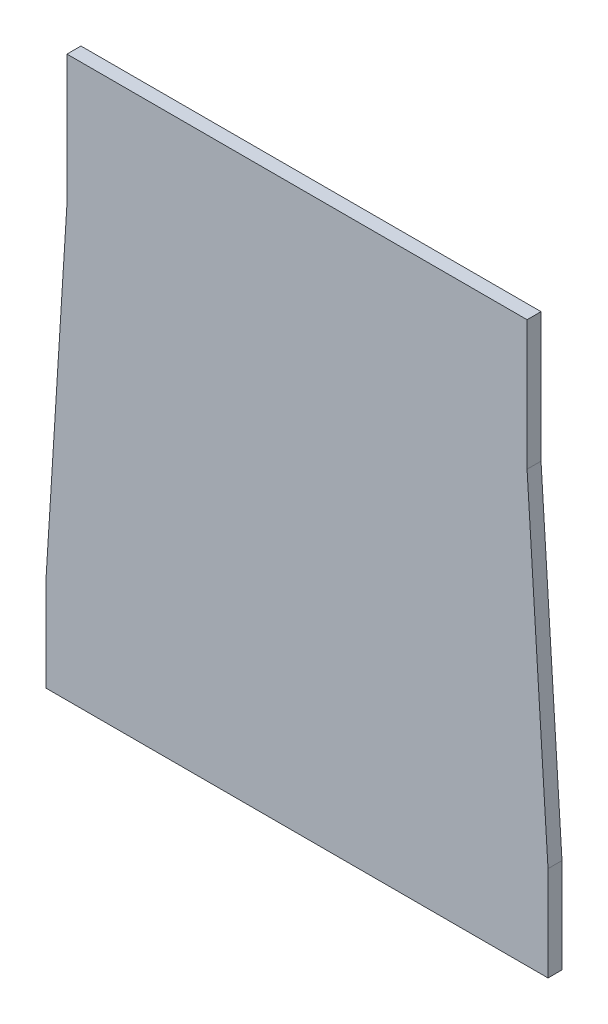
ISO-10303-21;
HEADER;
FILE_DESCRIPTION(('STEP AP214'),'2;1');
FILE_NAME('part.step','',(''),(''),'','','');
FILE_SCHEMA(('AUTOMOTIVE_DESIGN { 1 0 10303 214 1 1 1 1 }'));
ENDSEC;
DATA;
#1=APPLICATION_CONTEXT('core data for automotive mechanical design processes');
#2=APPLICATION_PROTOCOL_DEFINITION('international standard','automotive_design',2000,#1);
#3=PRODUCT_CONTEXT('',#1,'mechanical');
#4=PRODUCT('Part','Part','',(#3));
#5=PRODUCT_RELATED_PRODUCT_CATEGORY('part','',(#4));
#6=PRODUCT_DEFINITION_FORMATION('','',#4);
#7=PRODUCT_DEFINITION_CONTEXT('part definition',#1,'design');
#8=PRODUCT_DEFINITION('design','',#6,#7);
#9=PRODUCT_DEFINITION_SHAPE('','',#8);
#10=(LENGTH_UNIT() NAMED_UNIT(*) SI_UNIT(.MILLI.,.METRE.));
#11=(NAMED_UNIT(*) PLANE_ANGLE_UNIT() SI_UNIT($,.RADIAN.));
#12=(NAMED_UNIT(*) SI_UNIT($,.STERADIAN.) SOLID_ANGLE_UNIT());
#13=UNCERTAINTY_MEASURE_WITH_UNIT(LENGTH_MEASURE(1.E-05),#10,'distance_accuracy_value','');
#14=(GEOMETRIC_REPRESENTATION_CONTEXT(3) GLOBAL_UNCERTAINTY_ASSIGNED_CONTEXT((#13)) GLOBAL_UNIT_ASSIGNED_CONTEXT((#10,
#11,#12)) REPRESENTATION_CONTEXT('',''));
#15=CARTESIAN_POINT('',(0.,0.,0.));
#16=DIRECTION('',(0.,0.,1.));
#17=DIRECTION('',(1.,0.,0.));
#18=AXIS2_PLACEMENT_3D('',#15,#16,#17);
#19=CARTESIAN_POINT('',(209.03946,-5469.17953057513,12.7));
#20=DIRECTION('',(-1.,0.,0.));
#21=DIRECTION('',(0.,0.,1.));
#22=AXIS2_PLACEMENT_3D('',#19,#20,#21);
#23=PLANE('',#22);
#24=DIRECTION('',(0.,1.,0.));
#25=VECTOR('',#24,1.);
#26=CARTESIAN_POINT('',(209.03946,-5469.17953057513,12.7));
#27=LINE('',#26,#25);
#28=CARTESIAN_POINT('',(209.03946,-5142.55276698741,12.7));
#29=VERTEX_POINT('',#28);
#30=CARTESIAN_POINT('',(209.03946,-5024.87840407149,12.7));
#31=VERTEX_POINT('',#30);
#32=EDGE_CURVE('E139',#29,#31,#27,.T.);
#33=ORIENTED_EDGE('',*,*,#32,.F.);
#34=DIRECTION('',(0.,0.,-1.));
#35=VECTOR('',#34,1.);
#36=CARTESIAN_POINT('',(209.03946,-5142.55276698741,12.7));
#37=LINE('',#36,#35);
#38=CARTESIAN_POINT('',(209.03946,-5142.55276698741,0.));
#39=VERTEX_POINT('',#38);
#40=EDGE_CURVE('E145',#29,#39,#37,.T.);
#41=ORIENTED_EDGE('',*,*,#40,.T.);
#42=DIRECTION('',(0.,1.,0.));
#43=VECTOR('',#42,1.);
#44=CARTESIAN_POINT('',(209.03946,-5469.17953057513,0.));
#45=LINE('',#44,#43);
#46=CARTESIAN_POINT('',(209.03946,-5024.87840407149,0.));
#47=VERTEX_POINT('',#46);
#48=EDGE_CURVE('E136',#39,#47,#45,.T.);
#49=ORIENTED_EDGE('',*,*,#48,.T.);
#50=DIRECTION('',(0.,0.,-1.));
#51=VECTOR('',#50,1.);
#52=CARTESIAN_POINT('',(209.03946,-5024.87840407149,12.7));
#53=LINE('',#52,#51);
#54=EDGE_CURVE('E133',#31,#47,#53,.T.);
#55=ORIENTED_EDGE('',*,*,#54,.F.);
#56=EDGE_LOOP('',(#33,#41,#49,#55));
#57=FACE_BOUND('',#56,.T.);
#58=ADVANCED_FACE('F33',(#57),#23,.F.);
#59=CARTESIAN_POINT('',(-209.03946,-5469.17953057513,12.7));
#60=DIRECTION('',(1.,0.,0.));
#61=DIRECTION('',(0.,0.,-1.));
#62=AXIS2_PLACEMENT_3D('',#59,#60,#61);
#63=PLANE('',#62);
#64=DIRECTION('',(0.,-1.,0.));
#65=VECTOR('',#64,1.);
#66=CARTESIAN_POINT('',(-209.03946,-5469.17953057513,0.));
#67=LINE('',#66,#65);
#68=CARTESIAN_POINT('',(-209.03946,-5024.87840407149,0.));
#69=VERTEX_POINT('',#68);
#70=CARTESIAN_POINT('',(-209.03946,-5142.55276698741,0.));
#71=VERTEX_POINT('',#70);
#72=EDGE_CURVE('E142',#69,#71,#67,.T.);
#73=ORIENTED_EDGE('',*,*,#72,.T.);
#74=DIRECTION('',(0.,0.,1.));
#75=VECTOR('',#74,1.);
#76=CARTESIAN_POINT('',(-209.03946,-5142.55276698741,12.7));
#77=LINE('',#76,#75);
#78=CARTESIAN_POINT('',(-209.03946,-5142.55276698741,12.7));
#79=VERTEX_POINT('',#78);
#80=EDGE_CURVE('E151',#71,#79,#77,.T.);
#81=ORIENTED_EDGE('',*,*,#80,.T.);
#82=DIRECTION('',(0.,-1.,0.));
#83=VECTOR('',#82,1.);
#84=CARTESIAN_POINT('',(-209.03946,-5469.17953057513,12.7));
#85=LINE('',#84,#83);
#86=CARTESIAN_POINT('',(-209.03946,-5024.87840407149,12.7));
#87=VERTEX_POINT('',#86);
#88=EDGE_CURVE('E141',#87,#79,#85,.T.);
#89=ORIENTED_EDGE('',*,*,#88,.F.);
#90=DIRECTION('',(0.,0.,-1.));
#91=VECTOR('',#90,1.);
#92=CARTESIAN_POINT('',(-209.03946,-5024.87840407149,12.7));
#93=LINE('',#92,#91);
#94=EDGE_CURVE('E130',#87,#69,#93,.T.);
#95=ORIENTED_EDGE('',*,*,#94,.T.);
#96=EDGE_LOOP('',(#73,#81,#89,#95));
#97=FACE_BOUND('',#96,.T.);
#98=ADVANCED_FACE('F163',(#97),#63,.F.);
#99=CARTESIAN_POINT('',(0.,0.,12.7));
#100=DIRECTION('',(0.,0.,1.));
#101=DIRECTION('',(1.,0.,0.));
#102=AXIS2_PLACEMENT_3D('',#99,#100,#101);
#103=PLANE('',#102);
#104=DIRECTION('',(1.,0.,0.));
#105=VECTOR('',#104,1.);
#106=CARTESIAN_POINT('',(-228.088766336441,-5533.41550298787,12.6999999999907));
#107=LINE('',#106,#105);
#108=CARTESIAN_POINT('',(-228.088766336441,-5533.41550298787,12.6999999999907));
#109=VERTEX_POINT('',#108);
#110=CARTESIAN_POINT('',(228.088766336443,-5533.41550298787,12.6999999999907));
#111=VERTEX_POINT('',#110);
#112=EDGE_CURVE('E109',#109,#111,#107,.T.);
#113=ORIENTED_EDGE('',*,*,#112,.T.);
#114=DIRECTION('',(0.,-1.,0.));
#115=VECTOR('',#114,1.);
#116=CARTESIAN_POINT('',(228.088766336441,-5447.35276698741,12.7));
#117=LINE('',#116,#115);
#118=CARTESIAN_POINT('',(228.088766336441,-5447.34166837047,12.7));
#119=VERTEX_POINT('',#118);
#120=EDGE_CURVE('E119',#119,#111,#117,.T.);
#121=ORIENTED_EDGE('',*,*,#120,.F.);
#122=DIRECTION('',(-0.0623782861551805,0.998052578482889,0.));
#123=VECTOR('',#122,1.);
#124=CARTESIAN_POINT('',(209.03946,-5142.55276698741,12.7));
#125=LINE('',#124,#123);
#126=EDGE_CURVE('E157',#119,#29,#125,.T.);
#127=ORIENTED_EDGE('',*,*,#126,.T.);
#128=ORIENTED_EDGE('',*,*,#32,.T.);
#129=DIRECTION('',(1.,0.,0.));
#130=VECTOR('',#129,1.);
#131=CARTESIAN_POINT('',(-209.03946,-5024.87840407149,12.7));
#132=LINE('',#131,#130);
#133=EDGE_CURVE('E127',#87,#31,#132,.T.);
#134=ORIENTED_EDGE('',*,*,#133,.F.);
#135=ORIENTED_EDGE('',*,*,#88,.T.);
#136=DIRECTION('',(-0.0623782861551805,-0.998052578482889,0.));
#137=VECTOR('',#136,1.);
#138=CARTESIAN_POINT('',(-209.03946,-5142.55276698741,12.7));
#139=LINE('',#138,#137);
#140=CARTESIAN_POINT('',(-228.088766336441,-5447.34166837047,12.7));
#141=VERTEX_POINT('',#140);
#142=EDGE_CURVE('E77',#79,#141,#139,.T.);
#143=ORIENTED_EDGE('',*,*,#142,.T.);
#144=DIRECTION('',(0.,1.,0.));
#145=VECTOR('',#144,1.);
#146=CARTESIAN_POINT('',(-228.088766336441,-5447.35276698741,12.7));
#147=LINE('',#146,#145);
#148=EDGE_CURVE('E118',#109,#141,#147,.T.);
#149=ORIENTED_EDGE('',*,*,#148,.F.);
#150=EDGE_LOOP('',(#113,#121,#127,#128,#134,#135,#143,#149));
#151=FACE_BOUND('',#150,.T.);
#152=ADVANCED_FACE('F160',(#151),#103,.T.);
#153=CARTESIAN_POINT('',(0.,0.,0.));
#154=DIRECTION('',(0.,0.,1.));
#155=DIRECTION('',(1.,0.,0.));
#156=AXIS2_PLACEMENT_3D('',#153,#154,#155);
#157=PLANE('',#156);
#158=DIRECTION('',(0.,-1.,0.));
#159=VECTOR('',#158,1.);
#160=CARTESIAN_POINT('',(228.088766336441,-5447.35276698741,0.));
#161=LINE('',#160,#159);
#162=CARTESIAN_POINT('',(228.088766336441,-5447.34166837047,0.));
#163=VERTEX_POINT('',#162);
#164=CARTESIAN_POINT('',(228.088766336441,-5533.41550298787,0.));
#165=VERTEX_POINT('',#164);
#166=EDGE_CURVE('E68',#163,#165,#161,.T.);
#167=ORIENTED_EDGE('',*,*,#166,.T.);
#168=DIRECTION('',(1.,0.,0.));
#169=VECTOR('',#168,1.);
#170=CARTESIAN_POINT('',(-228.088766336441,-5533.41550298787,0.));
#171=LINE('',#170,#169);
#172=CARTESIAN_POINT('',(-228.088766336441,-5533.41550298787,0.));
#173=VERTEX_POINT('',#172);
#174=EDGE_CURVE('E48',#173,#165,#171,.T.);
#175=ORIENTED_EDGE('',*,*,#174,.F.);
#176=DIRECTION('',(0.,1.,0.));
#177=VECTOR('',#176,1.);
#178=CARTESIAN_POINT('',(-228.088766336441,-5447.35276698741,0.));
#179=LINE('',#178,#177);
#180=CARTESIAN_POINT('',(-228.088766336441,-5447.34166837047,0.));
#181=VERTEX_POINT('',#180);
#182=EDGE_CURVE('E55',#173,#181,#179,.T.);
#183=ORIENTED_EDGE('',*,*,#182,.T.);
#184=DIRECTION('',(0.0623782861551805,0.998052578482889,0.));
#185=VECTOR('',#184,1.);
#186=CARTESIAN_POINT('',(111.932850240462,-6.99580314002884,0.));
#187=LINE('',#186,#185);
#188=EDGE_CURVE('E11',#181,#71,#187,.T.);
#189=ORIENTED_EDGE('',*,*,#188,.T.);
#190=ORIENTED_EDGE('',*,*,#72,.F.);
#191=DIRECTION('',(1.,0.,0.));
#192=VECTOR('',#191,1.);
#193=CARTESIAN_POINT('',(-209.03946,-5024.87840407149,0.));
#194=LINE('',#193,#192);
#195=EDGE_CURVE('E121',#69,#47,#194,.T.);
#196=ORIENTED_EDGE('',*,*,#195,.T.);
#197=ORIENTED_EDGE('',*,*,#48,.F.);
#198=DIRECTION('',(0.0623782861551805,-0.998052578482889,0.));
#199=VECTOR('',#198,1.);
#200=CARTESIAN_POINT('',(-111.932850240462,-6.99580314002884,0.));
#201=LINE('',#200,#199);
#202=EDGE_CURVE('E153',#39,#163,#201,.T.);
#203=ORIENTED_EDGE('',*,*,#202,.T.);
#204=EDGE_LOOP('',(#167,#175,#183,#189,#190,#196,#197,#203));
#205=FACE_BOUND('',#204,.T.);
#206=ADVANCED_FACE('F114',(#205),#157,.F.);
#207=CARTESIAN_POINT('',(-209.03946,-5024.87840407149,12.7));
#208=DIRECTION('',(0.,1.,0.));
#209=DIRECTION('',(0.,0.,1.));
#210=AXIS2_PLACEMENT_3D('',#207,#208,#209);
#211=PLANE('',#210);
#212=ORIENTED_EDGE('',*,*,#195,.F.);
#213=ORIENTED_EDGE('',*,*,#94,.F.);
#214=ORIENTED_EDGE('',*,*,#133,.T.);
#215=ORIENTED_EDGE('',*,*,#54,.T.);
#216=EDGE_LOOP('',(#212,#213,#214,#215));
#217=FACE_BOUND('',#216,.T.);
#218=ADVANCED_FACE('F167',(#217),#211,.T.);
#219=CARTESIAN_POINT('',(-228.088766336441,-5447.35276698741,12.7));
#220=DIRECTION('',(-1.,0.,0.));
#221=DIRECTION('',(0.,-1.,0.));
#222=AXIS2_PLACEMENT_3D('',#219,#220,#221);
#223=PLANE('',#222);
#224=DIRECTION('',(0.,0.,1.));
#225=VECTOR('',#224,1.);
#226=CARTESIAN_POINT('',(-228.088766336441,-5533.41550298787,12.6999999999907));
#227=LINE('',#226,#225);
#228=EDGE_CURVE('E106',#173,#109,#227,.T.);
#229=ORIENTED_EDGE('',*,*,#228,.T.);
#230=ORIENTED_EDGE('',*,*,#148,.T.);
#231=DIRECTION('',(0.,0.,-1.));
#232=VECTOR('',#231,1.);
#233=CARTESIAN_POINT('',(-228.088766336441,-5447.34166837047,12.7));
#234=LINE('',#233,#232);
#235=EDGE_CURVE('E41',#141,#181,#234,.T.);
#236=ORIENTED_EDGE('',*,*,#235,.T.);
#237=ORIENTED_EDGE('',*,*,#182,.F.);
#238=EDGE_LOOP('',(#229,#230,#236,#237));
#239=FACE_BOUND('',#238,.T.);
#240=ADVANCED_FACE('F116',(#239),#223,.T.);
#241=CARTESIAN_POINT('',(228.088766336441,-5447.35276698741,12.7));
#242=DIRECTION('',(1.,0.,0.));
#243=DIRECTION('',(0.,1.,0.));
#244=AXIS2_PLACEMENT_3D('',#241,#242,#243);
#245=PLANE('',#244);
#246=DIRECTION('',(0.,0.,1.));
#247=VECTOR('',#246,1.);
#248=CARTESIAN_POINT('',(228.088766336443,-5533.41550298787,12.6999999999907));
#249=LINE('',#248,#247);
#250=EDGE_CURVE('E112',#165,#111,#249,.T.);
#251=ORIENTED_EDGE('',*,*,#250,.F.);
#252=ORIENTED_EDGE('',*,*,#166,.F.);
#253=DIRECTION('',(0.,0.,1.));
#254=VECTOR('',#253,1.);
#255=CARTESIAN_POINT('',(228.088766336441,-5447.34166837047,12.7));
#256=LINE('',#255,#254);
#257=EDGE_CURVE('E155',#163,#119,#256,.T.);
#258=ORIENTED_EDGE('',*,*,#257,.T.);
#259=ORIENTED_EDGE('',*,*,#120,.T.);
#260=EDGE_LOOP('',(#251,#252,#258,#259));
#261=FACE_BOUND('',#260,.T.);
#262=ADVANCED_FACE('F177',(#261),#245,.T.);
#263=CARTESIAN_POINT('',(209.03946,-5142.55276698741,12.7));
#264=DIRECTION('',(-0.998052578482889,-0.0623782861551805,0.));
#265=DIRECTION('',(0.,0.,-1.));
#266=AXIS2_PLACEMENT_3D('',#263,#264,#265);
#267=PLANE('',#266);
#268=ORIENTED_EDGE('',*,*,#126,.F.);
#269=ORIENTED_EDGE('',*,*,#257,.F.);
#270=ORIENTED_EDGE('',*,*,#202,.F.);
#271=ORIENTED_EDGE('',*,*,#40,.F.);
#272=EDGE_LOOP('',(#268,#269,#270,#271));
#273=FACE_BOUND('',#272,.T.);
#274=ADVANCED_FACE('F176',(#273),#267,.F.);
#275=CARTESIAN_POINT('',(-209.03946,-5142.55276698741,12.7));
#276=DIRECTION('',(0.998052578482889,-0.0623782861551805,0.));
#277=DIRECTION('',(0.,0.,1.));
#278=AXIS2_PLACEMENT_3D('',#275,#276,#277);
#279=PLANE('',#278);
#280=ORIENTED_EDGE('',*,*,#188,.F.);
#281=ORIENTED_EDGE('',*,*,#235,.F.);
#282=ORIENTED_EDGE('',*,*,#142,.F.);
#283=ORIENTED_EDGE('',*,*,#80,.F.);
#284=EDGE_LOOP('',(#280,#281,#282,#283));
#285=FACE_BOUND('',#284,.T.);
#286=ADVANCED_FACE('F35',(#285),#279,.F.);
#287=CARTESIAN_POINT('',(-228.088766336441,-5533.41550298787,12.6999999999907));
#288=DIRECTION('',(0.,1.,0.));
#289=DIRECTION('',(0.,0.,1.));
#290=AXIS2_PLACEMENT_3D('',#287,#288,#289);
#291=PLANE('',#290);
#292=ORIENTED_EDGE('',*,*,#250,.T.);
#293=ORIENTED_EDGE('',*,*,#112,.F.);
#294=ORIENTED_EDGE('',*,*,#228,.F.);
#295=ORIENTED_EDGE('',*,*,#174,.T.);
#296=EDGE_LOOP('',(#292,#293,#294,#295));
#297=FACE_BOUND('',#296,.T.);
#298=ADVANCED_FACE('F107',(#297),#291,.F.);
#299=CLOSED_SHELL('',(#58,#98,#152,#206,#218,#240,#262,#274,#286,#298));
#300=MANIFOLD_SOLID_BREP('B2',#299);
#301=ADVANCED_BREP_SHAPE_REPRESENTATION('',(#18,#300),#14);
#302=SHAPE_DEFINITION_REPRESENTATION(#9,#301);
ENDSEC;
END-ISO-10303-21;
